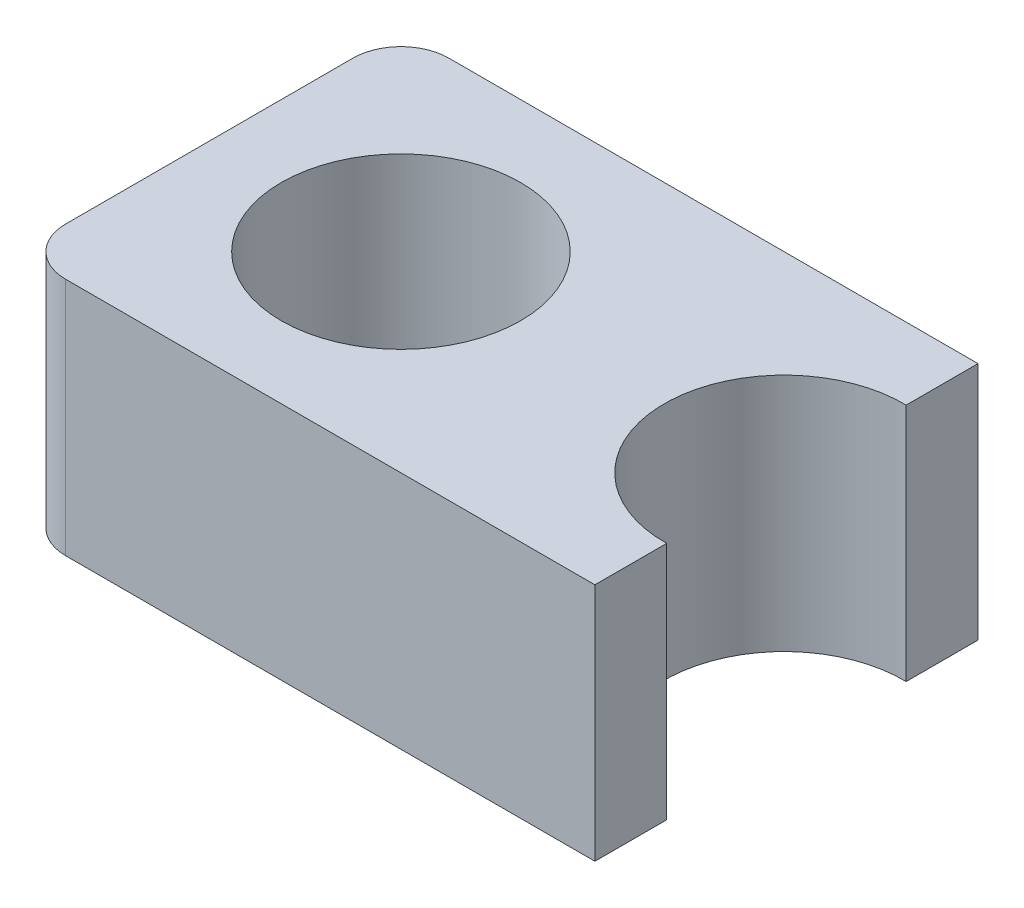
ISO-10303-21;
HEADER;
FILE_DESCRIPTION(('STEP AP214'),'2;1');
FILE_NAME('part.step','',(''),(''),'','','');
FILE_SCHEMA(('AUTOMOTIVE_DESIGN { 1 0 10303 214 1 1 1 1 }'));
ENDSEC;
DATA;
#1=APPLICATION_CONTEXT('core data for automotive mechanical design processes');
#2=APPLICATION_PROTOCOL_DEFINITION('international standard','automotive_design',2000,#1);
#3=PRODUCT_CONTEXT('',#1,'mechanical');
#4=PRODUCT('Part','Part','',(#3));
#5=PRODUCT_RELATED_PRODUCT_CATEGORY('part','',(#4));
#6=PRODUCT_DEFINITION_FORMATION('','',#4);
#7=PRODUCT_DEFINITION_CONTEXT('part definition',#1,'design');
#8=PRODUCT_DEFINITION('design','',#6,#7);
#9=PRODUCT_DEFINITION_SHAPE('','',#8);
#10=(LENGTH_UNIT() NAMED_UNIT(*) SI_UNIT(.MILLI.,.METRE.));
#11=(NAMED_UNIT(*) PLANE_ANGLE_UNIT() SI_UNIT($,.RADIAN.));
#12=(NAMED_UNIT(*) SI_UNIT($,.STERADIAN.) SOLID_ANGLE_UNIT());
#13=UNCERTAINTY_MEASURE_WITH_UNIT(LENGTH_MEASURE(1.E-05),#10,'distance_accuracy_value','');
#14=(GEOMETRIC_REPRESENTATION_CONTEXT(3) GLOBAL_UNCERTAINTY_ASSIGNED_CONTEXT((#13)) GLOBAL_UNIT_ASSIGNED_CONTEXT((#10,
#11,#12)) REPRESENTATION_CONTEXT('',''));
#15=CARTESIAN_POINT('',(0.,0.,0.));
#16=DIRECTION('',(0.,0.,1.));
#17=DIRECTION('',(1.,0.,0.));
#18=AXIS2_PLACEMENT_3D('',#15,#16,#17);
#19=CARTESIAN_POINT('',(18.7899998505849,0.5,-7.05000014941506));
#20=DIRECTION('',(0.,-1.,0.));
#21=DIRECTION('',(0.,0.,-1.));
#22=AXIS2_PLACEMENT_3D('',#19,#20,#21);
#23=CYLINDRICAL_SURFACE('',#22,0.199999850585018);
#24=CARTESIAN_POINT('',(18.7899998505849,-0.500000044703484,-7.05000014941506));
#25=DIRECTION('',(0.,-1.,0.));
#26=DIRECTION('',(0.,0.,-1.));
#27=AXIS2_PLACEMENT_3D('',#24,#25,#26);
#28=CIRCLE('',#27,0.199999850585018);
#29=CARTESIAN_POINT('',(18.7899999252924,-0.500000044703484,-7.25));
#30=VERTEX_POINT('',#29);
#31=CARTESIAN_POINT('',(18.59,-0.500000044703484,-7.05000007470753));
#32=VERTEX_POINT('',#31);
#33=EDGE_CURVE('E92',#30,#32,#28,.F.);
#34=ORIENTED_EDGE('',*,*,#33,.T.);
#35=DIRECTION('',(0.,1.,0.));
#36=VECTOR('',#35,1.);
#37=CARTESIAN_POINT('',(18.59,0.5,-7.05));
#38=LINE('',#37,#36);
#39=CARTESIAN_POINT('',(18.59,0.5,-7.05000007470753));
#40=VERTEX_POINT('',#39);
#41=EDGE_CURVE('E91',#40,#32,#38,.F.);
#42=ORIENTED_EDGE('',*,*,#41,.F.);
#43=CARTESIAN_POINT('',(18.7899998505849,0.5,-7.05000014941506));
#44=DIRECTION('',(0.,-1.,0.));
#45=DIRECTION('',(0.,0.,-1.));
#46=AXIS2_PLACEMENT_3D('',#43,#44,#45);
#47=CIRCLE('',#46,0.199999850585018);
#48=CARTESIAN_POINT('',(18.7899999252924,0.5,-7.25));
#49=VERTEX_POINT('',#48);
#50=EDGE_CURVE('E20',#49,#40,#47,.F.);
#51=ORIENTED_EDGE('',*,*,#50,.F.);
#52=DIRECTION('',(0.,1.,0.));
#53=VECTOR('',#52,1.);
#54=CARTESIAN_POINT('',(18.79,0.5,-7.25));
#55=LINE('',#54,#53);
#56=EDGE_CURVE('E77',#30,#49,#55,.T.);
#57=ORIENTED_EDGE('',*,*,#56,.F.);
#58=EDGE_LOOP('',(#34,#42,#51,#57));
#59=FACE_BOUND('',#58,.T.);
#60=ADVANCED_FACE('F17',(#59),#23,.T.);
#61=CARTESIAN_POINT('',(18.59,0.5,-5.85));
#62=DIRECTION('',(-1.,0.,0.));
#63=DIRECTION('',(0.,0.,1.));
#64=AXIS2_PLACEMENT_3D('',#61,#62,#63);
#65=PLANE('',#64);
#66=DIRECTION('',(0.,0.,1.));
#67=VECTOR('',#66,1.);
#68=CARTESIAN_POINT('',(18.59,-0.500000044703484,-0.5));
#69=LINE('',#68,#67);
#70=CARTESIAN_POINT('',(18.59,-0.500000044703484,-5.8499999252925));
#71=VERTEX_POINT('',#70);
#72=EDGE_CURVE('E138',#32,#71,#69,.T.);
#73=ORIENTED_EDGE('',*,*,#72,.T.);
#74=DIRECTION('',(0.,-1.,0.));
#75=VECTOR('',#74,1.);
#76=CARTESIAN_POINT('',(18.5899999999999,0.5,-5.85));
#77=LINE('',#76,#75);
#78=CARTESIAN_POINT('',(18.59,0.5,-5.8499999252925));
#79=VERTEX_POINT('',#78);
#80=EDGE_CURVE('E96',#79,#71,#77,.T.);
#81=ORIENTED_EDGE('',*,*,#80,.F.);
#82=DIRECTION('',(0.,0.,1.));
#83=VECTOR('',#82,1.);
#84=CARTESIAN_POINT('',(18.59,0.5,-0.5));
#85=LINE('',#84,#83);
#86=EDGE_CURVE('E85',#40,#79,#85,.T.);
#87=ORIENTED_EDGE('',*,*,#86,.F.);
#88=ORIENTED_EDGE('',*,*,#41,.T.);
#89=EDGE_LOOP('',(#73,#81,#87,#88));
#90=FACE_BOUND('',#89,.T.);
#91=ADVANCED_FACE('F98',(#90),#65,.T.);
#92=CARTESIAN_POINT('',(18.7899998505849,0.5,-5.84999985058499));
#93=DIRECTION('',(0.,-1.,0.));
#94=DIRECTION('',(0.,0.,-1.));
#95=AXIS2_PLACEMENT_3D('',#92,#93,#94);
#96=CYLINDRICAL_SURFACE('',#95,0.199999850585018);
#97=CARTESIAN_POINT('',(18.7899998505849,-0.500000044703484,-5.84999985058499));
#98=DIRECTION('',(0.,-1.,0.));
#99=DIRECTION('',(0.,0.,-1.));
#100=AXIS2_PLACEMENT_3D('',#97,#98,#99);
#101=CIRCLE('',#100,0.199999850585018);
#102=CARTESIAN_POINT('',(18.7899999252924,-0.500000044703484,-5.65));
#103=VERTEX_POINT('',#102);
#104=EDGE_CURVE('E134',#71,#103,#101,.F.);
#105=ORIENTED_EDGE('',*,*,#104,.T.);
#106=DIRECTION('',(0.,1.,0.));
#107=VECTOR('',#106,1.);
#108=CARTESIAN_POINT('',(18.79,0.5,-5.65));
#109=LINE('',#108,#107);
#110=CARTESIAN_POINT('',(18.7899999252924,0.5,-5.65));
#111=VERTEX_POINT('',#110);
#112=EDGE_CURVE('E121',#111,#103,#109,.F.);
#113=ORIENTED_EDGE('',*,*,#112,.F.);
#114=CARTESIAN_POINT('',(18.7899998505849,0.5,-5.84999985058499));
#115=DIRECTION('',(0.,-1.,0.));
#116=DIRECTION('',(0.,0.,-1.));
#117=AXIS2_PLACEMENT_3D('',#114,#115,#116);
#118=CIRCLE('',#117,0.199999850585018);
#119=EDGE_CURVE('E100',#79,#111,#118,.F.);
#120=ORIENTED_EDGE('',*,*,#119,.F.);
#121=ORIENTED_EDGE('',*,*,#80,.T.);
#122=EDGE_LOOP('',(#105,#113,#120,#121));
#123=FACE_BOUND('',#122,.T.);
#124=ADVANCED_FACE('F189',(#123),#96,.T.);
#125=CARTESIAN_POINT('',(21.,0.5,-5.65));
#126=DIRECTION('',(0.,0.,1.));
#127=DIRECTION('',(1.,0.,0.));
#128=AXIS2_PLACEMENT_3D('',#125,#126,#127);
#129=PLANE('',#128);
#130=DIRECTION('',(1.,0.,0.));
#131=VECTOR('',#130,1.);
#132=CARTESIAN_POINT('',(20.5,-0.500000044703484,-5.65));
#133=LINE('',#132,#131);
#134=CARTESIAN_POINT('',(21.,-0.500000044703484,-5.65));
#135=VERTEX_POINT('',#134);
#136=EDGE_CURVE('E137',#103,#135,#133,.T.);
#137=ORIENTED_EDGE('',*,*,#136,.T.);
#138=DIRECTION('',(0.,1.,0.));
#139=VECTOR('',#138,1.);
#140=CARTESIAN_POINT('',(21.,0.5,-5.65));
#141=LINE('',#140,#139);
#142=CARTESIAN_POINT('',(21.,0.5,-5.65));
#143=VERTEX_POINT('',#142);
#144=EDGE_CURVE('E119',#143,#135,#141,.F.);
#145=ORIENTED_EDGE('',*,*,#144,.F.);
#146=DIRECTION('',(1.,0.,0.));
#147=VECTOR('',#146,1.);
#148=CARTESIAN_POINT('',(20.5,0.5,-5.65));
#149=LINE('',#148,#147);
#150=EDGE_CURVE('E102',#111,#143,#149,.T.);
#151=ORIENTED_EDGE('',*,*,#150,.F.);
#152=ORIENTED_EDGE('',*,*,#112,.T.);
#153=EDGE_LOOP('',(#137,#145,#151,#152));
#154=FACE_BOUND('',#153,.T.);
#155=ADVANCED_FACE('F185',(#154),#129,.T.);
#156=CARTESIAN_POINT('',(21.,0.5,-5.95010001000201));
#157=DIRECTION('',(1.,0.,0.));
#158=DIRECTION('',(0.,0.,-1.));
#159=AXIS2_PLACEMENT_3D('',#156,#157,#158);
#160=PLANE('',#159);
#161=DIRECTION('',(0.,0.,1.));
#162=VECTOR('',#161,1.);
#163=CARTESIAN_POINT('',(21.,-0.500000044703484,-0.5));
#164=LINE('',#163,#162);
#165=CARTESIAN_POINT('',(21.,-0.500000044703484,-5.95010001000201));
#166=VERTEX_POINT('',#165);
#167=EDGE_CURVE('E133',#135,#166,#164,.F.);
#168=ORIENTED_EDGE('',*,*,#167,.T.);
#169=DIRECTION('',(0.,-1.,0.));
#170=VECTOR('',#169,1.);
#171=CARTESIAN_POINT('',(21.,0.5,-5.95010001000201));
#172=LINE('',#171,#170);
#173=CARTESIAN_POINT('',(21.,0.5,-5.95010001000201));
#174=VERTEX_POINT('',#173);
#175=EDGE_CURVE('E116',#166,#174,#172,.F.);
#176=ORIENTED_EDGE('',*,*,#175,.T.);
#177=DIRECTION('',(0.,0.,1.));
#178=VECTOR('',#177,1.);
#179=CARTESIAN_POINT('',(21.,0.5,-0.5));
#180=LINE('',#179,#178);
#181=EDGE_CURVE('E142',#143,#174,#180,.F.);
#182=ORIENTED_EDGE('',*,*,#181,.F.);
#183=ORIENTED_EDGE('',*,*,#144,.T.);
#184=EDGE_LOOP('',(#168,#176,#182,#183));
#185=FACE_BOUND('',#184,.T.);
#186=ADVANCED_FACE('F181',(#185),#160,.T.);
#187=CARTESIAN_POINT('',(20.9899999999996,0.5,-6.45));
#188=DIRECTION('',(0.,-1.,0.));
#189=DIRECTION('',(0.,0.,-1.));
#190=AXIS2_PLACEMENT_3D('',#187,#188,#189);
#191=CYLINDRICAL_SURFACE('',#190,0.5);
#192=ORIENTED_EDGE('',*,*,#175,.F.);
#193=CARTESIAN_POINT('',(20.9899999999996,-0.500000044703484,-6.45));
#194=DIRECTION('',(0.,-1.,0.));
#195=DIRECTION('',(0.,0.,-1.));
#196=AXIS2_PLACEMENT_3D('',#193,#194,#195);
#197=CIRCLE('',#196,0.5);
#198=CARTESIAN_POINT('',(21.,-0.500000044703484,-6.94989998999799));
#199=VERTEX_POINT('',#198);
#200=EDGE_CURVE('E129',#166,#199,#197,.T.);
#201=ORIENTED_EDGE('',*,*,#200,.T.);
#202=DIRECTION('',(0.,1.,0.));
#203=VECTOR('',#202,1.);
#204=CARTESIAN_POINT('',(21.,0.5,-6.94989998999799));
#205=LINE('',#204,#203);
#206=CARTESIAN_POINT('',(21.,0.5,-6.94989998999799));
#207=VERTEX_POINT('',#206);
#208=EDGE_CURVE('E112',#207,#199,#205,.F.);
#209=ORIENTED_EDGE('',*,*,#208,.F.);
#210=CARTESIAN_POINT('',(20.9899999999996,0.5,-6.45));
#211=DIRECTION('',(0.,-1.,0.));
#212=DIRECTION('',(0.,0.,-1.));
#213=AXIS2_PLACEMENT_3D('',#210,#211,#212);
#214=CIRCLE('',#213,0.5);
#215=EDGE_CURVE('E141',#174,#207,#214,.T.);
#216=ORIENTED_EDGE('',*,*,#215,.F.);
#217=EDGE_LOOP('',(#192,#201,#209,#216));
#218=FACE_BOUND('',#217,.T.);
#219=ADVANCED_FACE('F177',(#218),#191,.F.);
#220=CARTESIAN_POINT('',(21.,0.5,-7.25));
#221=DIRECTION('',(1.,0.,0.));
#222=DIRECTION('',(0.,0.,-1.));
#223=AXIS2_PLACEMENT_3D('',#220,#221,#222);
#224=PLANE('',#223);
#225=DIRECTION('',(0.,0.,1.));
#226=VECTOR('',#225,1.);
#227=CARTESIAN_POINT('',(21.,-0.500000044703484,-0.5));
#228=LINE('',#227,#226);
#229=CARTESIAN_POINT('',(21.,-0.500000044703484,-7.25));
#230=VERTEX_POINT('',#229);
#231=EDGE_CURVE('E132',#199,#230,#228,.F.);
#232=ORIENTED_EDGE('',*,*,#231,.T.);
#233=DIRECTION('',(0.,1.,0.));
#234=VECTOR('',#233,1.);
#235=CARTESIAN_POINT('',(21.,0.5,-7.25));
#236=LINE('',#235,#234);
#237=CARTESIAN_POINT('',(21.,0.5,-7.25));
#238=VERTEX_POINT('',#237);
#239=EDGE_CURVE('E35',#238,#230,#236,.F.);
#240=ORIENTED_EDGE('',*,*,#239,.F.);
#241=DIRECTION('',(0.,0.,1.));
#242=VECTOR('',#241,1.);
#243=CARTESIAN_POINT('',(21.,0.5,-0.5));
#244=LINE('',#243,#242);
#245=EDGE_CURVE('E140',#207,#238,#244,.F.);
#246=ORIENTED_EDGE('',*,*,#245,.F.);
#247=ORIENTED_EDGE('',*,*,#208,.T.);
#248=EDGE_LOOP('',(#232,#240,#246,#247));
#249=FACE_BOUND('',#248,.T.);
#250=ADVANCED_FACE('F174',(#249),#224,.T.);
#251=CARTESIAN_POINT('',(18.79,0.5,-7.25));
#252=DIRECTION('',(0.,0.,-1.));
#253=DIRECTION('',(-1.,0.,0.));
#254=AXIS2_PLACEMENT_3D('',#251,#252,#253);
#255=PLANE('',#254);
#256=DIRECTION('',(1.,0.,0.));
#257=VECTOR('',#256,1.);
#258=CARTESIAN_POINT('',(20.5,-0.500000044703484,-7.25));
#259=LINE('',#258,#257);
#260=EDGE_CURVE('E128',#230,#30,#259,.F.);
#261=ORIENTED_EDGE('',*,*,#260,.T.);
#262=ORIENTED_EDGE('',*,*,#56,.T.);
#263=DIRECTION('',(1.,0.,0.));
#264=VECTOR('',#263,1.);
#265=CARTESIAN_POINT('',(20.5,0.5,-7.25));
#266=LINE('',#265,#264);
#267=EDGE_CURVE('E88',#238,#49,#266,.F.);
#268=ORIENTED_EDGE('',*,*,#267,.F.);
#269=ORIENTED_EDGE('',*,*,#239,.T.);
#270=EDGE_LOOP('',(#261,#262,#268,#269));
#271=FACE_BOUND('',#270,.T.);
#272=ADVANCED_FACE('F168',(#271),#255,.T.);
#273=CARTESIAN_POINT('',(20.5,0.5,-0.5));
#274=DIRECTION('',(0.,1.,0.));
#275=DIRECTION('',(0.,0.,1.));
#276=AXIS2_PLACEMENT_3D('',#273,#274,#275);
#277=PLANE('',#276);
#278=CARTESIAN_POINT('',(19.3899999999995,0.5,-6.45));
#279=DIRECTION('',(0.,-1.,0.));
#280=DIRECTION('',(0.,0.,-1.));
#281=AXIS2_PLACEMENT_3D('',#278,#279,#280);
#282=CIRCLE('',#281,0.5);
#283=CARTESIAN_POINT('',(19.3899999999995,0.5,-6.95));
#284=VERTEX_POINT('',#283);
#285=EDGE_CURVE('E26',#284,#284,#282,.T.);
#286=ORIENTED_EDGE('',*,*,#285,.T.);
#287=EDGE_LOOP('',(#286));
#288=FACE_BOUND('',#287,.T.);
#289=ORIENTED_EDGE('',*,*,#215,.T.);
#290=ORIENTED_EDGE('',*,*,#245,.T.);
#291=ORIENTED_EDGE('',*,*,#267,.T.);
#292=ORIENTED_EDGE('',*,*,#50,.T.);
#293=ORIENTED_EDGE('',*,*,#86,.T.);
#294=ORIENTED_EDGE('',*,*,#119,.T.);
#295=ORIENTED_EDGE('',*,*,#150,.T.);
#296=ORIENTED_EDGE('',*,*,#181,.T.);
#297=EDGE_LOOP('',(#289,#290,#291,#292,#293,#294,#295,#296));
#298=FACE_BOUND('',#297,.T.);
#299=ADVANCED_FACE('F83',(#288,#298),#277,.T.);
#300=CARTESIAN_POINT('',(20.5,-0.500000044703484,-0.5));
#301=DIRECTION('',(0.,1.,0.));
#302=DIRECTION('',(0.,0.,1.));
#303=AXIS2_PLACEMENT_3D('',#300,#301,#302);
#304=PLANE('',#303);
#305=CARTESIAN_POINT('',(19.3899999999995,-0.500000044703484,-6.45));
#306=DIRECTION('',(0.,-1.,0.));
#307=DIRECTION('',(0.,0.,-1.));
#308=AXIS2_PLACEMENT_3D('',#305,#306,#307);
#309=CIRCLE('',#308,0.5);
#310=CARTESIAN_POINT('',(19.3899999999995,-0.500000044703484,-6.95));
#311=VERTEX_POINT('',#310);
#312=EDGE_CURVE('E11',#311,#311,#309,.F.);
#313=ORIENTED_EDGE('',*,*,#312,.T.);
#314=EDGE_LOOP('',(#313));
#315=FACE_BOUND('',#314,.T.);
#316=ORIENTED_EDGE('',*,*,#231,.F.);
#317=ORIENTED_EDGE('',*,*,#200,.F.);
#318=ORIENTED_EDGE('',*,*,#167,.F.);
#319=ORIENTED_EDGE('',*,*,#136,.F.);
#320=ORIENTED_EDGE('',*,*,#104,.F.);
#321=ORIENTED_EDGE('',*,*,#72,.F.);
#322=ORIENTED_EDGE('',*,*,#33,.F.);
#323=ORIENTED_EDGE('',*,*,#260,.F.);
#324=EDGE_LOOP('',(#316,#317,#318,#319,#320,#321,#322,#323));
#325=FACE_BOUND('',#324,.T.);
#326=ADVANCED_FACE('F171',(#315,#325),#304,.F.);
#327=CARTESIAN_POINT('',(19.3899999999995,0.5,-6.45));
#328=DIRECTION('',(0.,-1.,0.));
#329=DIRECTION('',(0.,0.,-1.));
#330=AXIS2_PLACEMENT_3D('',#327,#328,#329);
#331=CYLINDRICAL_SURFACE('',#330,0.5);
#332=ORIENTED_EDGE('',*,*,#285,.F.);
#333=EDGE_LOOP('',(#332));
#334=FACE_BOUND('',#333,.T.);
#335=ORIENTED_EDGE('',*,*,#312,.F.);
#336=EDGE_LOOP('',(#335));
#337=FACE_BOUND('',#336,.T.);
#338=ADVANCED_FACE('F198',(#334,#337),#331,.F.);
#339=CLOSED_SHELL('',(#60,#91,#124,#155,#186,#219,#250,#272,#299,#326,#338));
#340=MANIFOLD_SOLID_BREP('B1',#339);
#341=ADVANCED_BREP_SHAPE_REPRESENTATION('',(#18,#340),#14);
#342=SHAPE_DEFINITION_REPRESENTATION(#9,#341);
ENDSEC;
END-ISO-10303-21;
